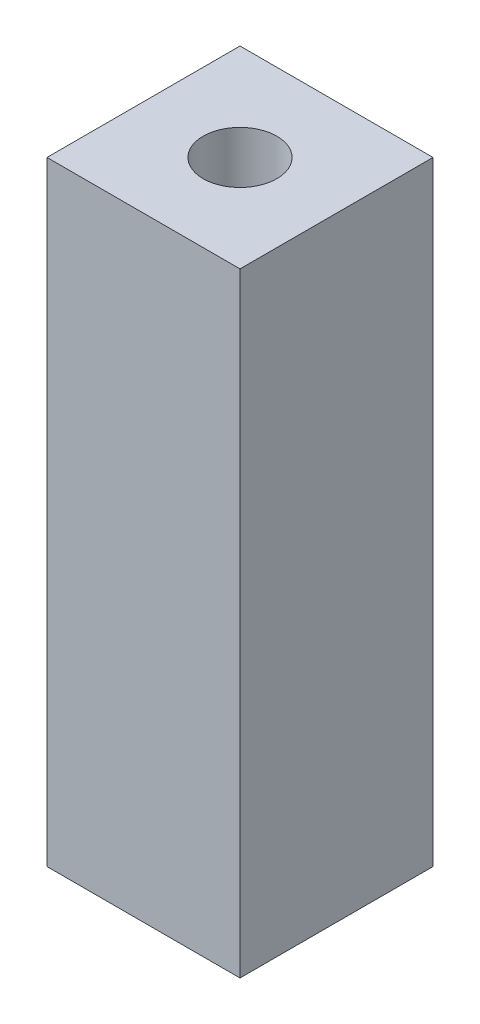
ISO-10303-21;
HEADER;
FILE_DESCRIPTION(('STEP AP214'),'2;1');
FILE_NAME('part.step','',(''),(''),'','','');
FILE_SCHEMA(('AUTOMOTIVE_DESIGN { 1 0 10303 214 1 1 1 1 }'));
ENDSEC;
DATA;
#1=APPLICATION_CONTEXT('core data for automotive mechanical design processes');
#2=APPLICATION_PROTOCOL_DEFINITION('international standard','automotive_design',2000,#1);
#3=PRODUCT_CONTEXT('',#1,'mechanical');
#4=PRODUCT('Part','Part','',(#3));
#5=PRODUCT_RELATED_PRODUCT_CATEGORY('part','',(#4));
#6=PRODUCT_DEFINITION_FORMATION('','',#4);
#7=PRODUCT_DEFINITION_CONTEXT('part definition',#1,'design');
#8=PRODUCT_DEFINITION('design','',#6,#7);
#9=PRODUCT_DEFINITION_SHAPE('','',#8);
#10=(LENGTH_UNIT() NAMED_UNIT(*) SI_UNIT(.MILLI.,.METRE.));
#11=(NAMED_UNIT(*) PLANE_ANGLE_UNIT() SI_UNIT($,.RADIAN.));
#12=(NAMED_UNIT(*) SI_UNIT($,.STERADIAN.) SOLID_ANGLE_UNIT());
#13=UNCERTAINTY_MEASURE_WITH_UNIT(LENGTH_MEASURE(1.E-05),#10,'distance_accuracy_value','');
#14=(GEOMETRIC_REPRESENTATION_CONTEXT(3) GLOBAL_UNCERTAINTY_ASSIGNED_CONTEXT((#13)) GLOBAL_UNIT_ASSIGNED_CONTEXT((#10,
#11,#12)) REPRESENTATION_CONTEXT('',''));
#15=CARTESIAN_POINT('',(0.,0.,0.));
#16=DIRECTION('',(0.,0.,1.));
#17=DIRECTION('',(1.,0.,0.));
#18=AXIS2_PLACEMENT_3D('',#15,#16,#17);
#19=CARTESIAN_POINT('',(5.5,35.,-5.5));
#20=DIRECTION('',(-1.,0.,0.));
#21=DIRECTION('',(0.,0.,1.));
#22=AXIS2_PLACEMENT_3D('',#19,#20,#21);
#23=PLANE('',#22);
#24=DIRECTION('',(0.,0.,-1.));
#25=VECTOR('',#24,1.);
#26=CARTESIAN_POINT('',(5.5,0.,-5.5));
#27=LINE('',#26,#25);
#28=CARTESIAN_POINT('',(5.5,0.,5.5));
#29=VERTEX_POINT('',#28);
#30=CARTESIAN_POINT('',(5.5,0.,-5.5));
#31=VERTEX_POINT('',#30);
#32=EDGE_CURVE('E106',#29,#31,#27,.T.);
#33=ORIENTED_EDGE('',*,*,#32,.T.);
#34=DIRECTION('',(0.,-1.,0.));
#35=VECTOR('',#34,1.);
#36=CARTESIAN_POINT('',(5.5,35.,-5.5));
#37=LINE('',#36,#35);
#38=CARTESIAN_POINT('',(5.5,35.,-5.5));
#39=VERTEX_POINT('',#38);
#40=EDGE_CURVE('E11',#39,#31,#37,.T.);
#41=ORIENTED_EDGE('',*,*,#40,.F.);
#42=DIRECTION('',(0.,0.,-1.));
#43=VECTOR('',#42,1.);
#44=CARTESIAN_POINT('',(5.5,35.,-5.5));
#45=LINE('',#44,#43);
#46=CARTESIAN_POINT('',(5.5,35.,5.5));
#47=VERTEX_POINT('',#46);
#48=EDGE_CURVE('E94',#47,#39,#45,.T.);
#49=ORIENTED_EDGE('',*,*,#48,.F.);
#50=DIRECTION('',(0.,-1.,0.));
#51=VECTOR('',#50,1.);
#52=CARTESIAN_POINT('',(5.5,35.,5.5));
#53=LINE('',#52,#51);
#54=EDGE_CURVE('E102',#47,#29,#53,.T.);
#55=ORIENTED_EDGE('',*,*,#54,.T.);
#56=EDGE_LOOP('',(#33,#41,#49,#55));
#57=FACE_BOUND('',#56,.T.);
#58=ADVANCED_FACE('F43',(#57),#23,.F.);
#59=CARTESIAN_POINT('',(-5.5,35.,-5.5));
#60=DIRECTION('',(0.,0.,1.));
#61=DIRECTION('',(1.,0.,0.));
#62=AXIS2_PLACEMENT_3D('',#59,#60,#61);
#63=PLANE('',#62);
#64=DIRECTION('',(-1.,0.,0.));
#65=VECTOR('',#64,1.);
#66=CARTESIAN_POINT('',(-5.5,0.,-5.5));
#67=LINE('',#66,#65);
#68=CARTESIAN_POINT('',(-5.5,0.,-5.5));
#69=VERTEX_POINT('',#68);
#70=EDGE_CURVE('E98',#31,#69,#67,.T.);
#71=ORIENTED_EDGE('',*,*,#70,.T.);
#72=DIRECTION('',(0.,-1.,0.));
#73=VECTOR('',#72,1.);
#74=CARTESIAN_POINT('',(-5.5,35.,-5.5));
#75=LINE('',#74,#73);
#76=CARTESIAN_POINT('',(-5.5,35.,-5.5));
#77=VERTEX_POINT('',#76);
#78=EDGE_CURVE('E51',#77,#69,#75,.T.);
#79=ORIENTED_EDGE('',*,*,#78,.F.);
#80=DIRECTION('',(-1.,0.,0.));
#81=VECTOR('',#80,1.);
#82=CARTESIAN_POINT('',(-5.5,35.,-5.5));
#83=LINE('',#82,#81);
#84=EDGE_CURVE('E89',#39,#77,#83,.T.);
#85=ORIENTED_EDGE('',*,*,#84,.F.);
#86=ORIENTED_EDGE('',*,*,#40,.T.);
#87=EDGE_LOOP('',(#71,#79,#85,#86));
#88=FACE_BOUND('',#87,.T.);
#89=ADVANCED_FACE('F97',(#88),#63,.F.);
#90=CARTESIAN_POINT('',(-5.5,35.,-5.5));
#91=DIRECTION('',(1.,0.,0.));
#92=DIRECTION('',(0.,0.,-1.));
#93=AXIS2_PLACEMENT_3D('',#90,#91,#92);
#94=PLANE('',#93);
#95=DIRECTION('',(0.,0.,1.));
#96=VECTOR('',#95,1.);
#97=CARTESIAN_POINT('',(-5.5,0.,-5.5));
#98=LINE('',#97,#96);
#99=CARTESIAN_POINT('',(-5.5,0.,5.5));
#100=VERTEX_POINT('',#99);
#101=EDGE_CURVE('E76',#69,#100,#98,.T.);
#102=ORIENTED_EDGE('',*,*,#101,.T.);
#103=DIRECTION('',(0.,-1.,0.));
#104=VECTOR('',#103,1.);
#105=CARTESIAN_POINT('',(-5.5,35.,5.5));
#106=LINE('',#105,#104);
#107=CARTESIAN_POINT('',(-5.5,35.,5.5));
#108=VERTEX_POINT('',#107);
#109=EDGE_CURVE('E99',#108,#100,#106,.T.);
#110=ORIENTED_EDGE('',*,*,#109,.F.);
#111=DIRECTION('',(0.,0.,1.));
#112=VECTOR('',#111,1.);
#113=CARTESIAN_POINT('',(-5.5,35.,-5.5));
#114=LINE('',#113,#112);
#115=EDGE_CURVE('E92',#77,#108,#114,.T.);
#116=ORIENTED_EDGE('',*,*,#115,.F.);
#117=ORIENTED_EDGE('',*,*,#78,.T.);
#118=EDGE_LOOP('',(#102,#110,#116,#117));
#119=FACE_BOUND('',#118,.T.);
#120=ADVANCED_FACE('F100',(#119),#94,.F.);
#121=CARTESIAN_POINT('',(-5.5,35.,5.5));
#122=DIRECTION('',(0.,0.,-1.));
#123=DIRECTION('',(-1.,0.,0.));
#124=AXIS2_PLACEMENT_3D('',#121,#122,#123);
#125=PLANE('',#124);
#126=DIRECTION('',(1.,0.,0.));
#127=VECTOR('',#126,1.);
#128=CARTESIAN_POINT('',(-5.5,0.,5.5));
#129=LINE('',#128,#127);
#130=EDGE_CURVE('E82',#100,#29,#129,.T.);
#131=ORIENTED_EDGE('',*,*,#130,.T.);
#132=ORIENTED_EDGE('',*,*,#54,.F.);
#133=DIRECTION('',(1.,0.,0.));
#134=VECTOR('',#133,1.);
#135=CARTESIAN_POINT('',(-5.5,35.,5.5));
#136=LINE('',#135,#134);
#137=EDGE_CURVE('E59',#108,#47,#136,.T.);
#138=ORIENTED_EDGE('',*,*,#137,.F.);
#139=ORIENTED_EDGE('',*,*,#109,.T.);
#140=EDGE_LOOP('',(#131,#132,#138,#139));
#141=FACE_BOUND('',#140,.T.);
#142=ADVANCED_FACE('F114',(#141),#125,.F.);
#143=CARTESIAN_POINT('',(0.,35.,0.));
#144=DIRECTION('',(0.,1.,0.));
#145=DIRECTION('',(0.,0.,1.));
#146=AXIS2_PLACEMENT_3D('',#143,#144,#145);
#147=PLANE('',#146);
#148=CARTESIAN_POINT('',(0.,35.,0.));
#149=DIRECTION('',(0.,1.,0.));
#150=DIRECTION('',(0.,0.,1.));
#151=AXIS2_PLACEMENT_3D('',#148,#149,#150);
#152=CIRCLE('',#151,2.09999999999999);
#153=CARTESIAN_POINT('',(0.,35.,2.09999999999999));
#154=VERTEX_POINT('',#153);
#155=EDGE_CURVE('E122',#154,#154,#152,.T.);
#156=ORIENTED_EDGE('',*,*,#155,.F.);
#157=EDGE_LOOP('',(#156));
#158=FACE_BOUND('',#157,.T.);
#159=ORIENTED_EDGE('',*,*,#48,.T.);
#160=ORIENTED_EDGE('',*,*,#84,.T.);
#161=ORIENTED_EDGE('',*,*,#115,.T.);
#162=ORIENTED_EDGE('',*,*,#137,.T.);
#163=EDGE_LOOP('',(#159,#160,#161,#162));
#164=FACE_BOUND('',#163,.T.);
#165=ADVANCED_FACE('F90',(#158,#164),#147,.T.);
#166=CARTESIAN_POINT('',(0.,0.,0.));
#167=DIRECTION('',(0.,1.,0.));
#168=DIRECTION('',(0.,0.,1.));
#169=AXIS2_PLACEMENT_3D('',#166,#167,#168);
#170=PLANE('',#169);
#171=CARTESIAN_POINT('',(0.,0.,0.));
#172=DIRECTION('',(0.,1.,0.));
#173=DIRECTION('',(0.,0.,1.));
#174=AXIS2_PLACEMENT_3D('',#171,#172,#173);
#175=CIRCLE('',#174,2.1);
#176=CARTESIAN_POINT('',(0.,0.,2.1));
#177=VERTEX_POINT('',#176);
#178=EDGE_CURVE('E109',#177,#177,#175,.T.);
#179=ORIENTED_EDGE('',*,*,#178,.T.);
#180=EDGE_LOOP('',(#179));
#181=FACE_BOUND('',#180,.T.);
#182=ORIENTED_EDGE('',*,*,#32,.F.);
#183=ORIENTED_EDGE('',*,*,#130,.F.);
#184=ORIENTED_EDGE('',*,*,#101,.F.);
#185=ORIENTED_EDGE('',*,*,#70,.F.);
#186=EDGE_LOOP('',(#182,#183,#184,#185));
#187=FACE_BOUND('',#186,.T.);
#188=ADVANCED_FACE('F117',(#181,#187),#170,.F.);
#189=CARTESIAN_POINT('',(0.,35.,0.));
#190=DIRECTION('',(0.,1.,0.));
#191=DIRECTION('',(0.,0.,1.));
#192=AXIS2_PLACEMENT_3D('',#189,#190,#191);
#193=CYLINDRICAL_SURFACE('',#192,2.09999999999999);
#194=ORIENTED_EDGE('',*,*,#178,.F.);
#195=EDGE_LOOP('',(#194));
#196=FACE_BOUND('',#195,.T.);
#197=ORIENTED_EDGE('',*,*,#155,.T.);
#198=EDGE_LOOP('',(#197));
#199=FACE_BOUND('',#198,.T.);
#200=ADVANCED_FACE('F126',(#196,#199),#193,.F.);
#201=CLOSED_SHELL('',(#58,#89,#120,#142,#165,#188,#200));
#202=MANIFOLD_SOLID_BREP('B2',#201);
#203=ADVANCED_BREP_SHAPE_REPRESENTATION('',(#18,#202),#14);
#204=SHAPE_DEFINITION_REPRESENTATION(#9,#203);
ENDSEC;
END-ISO-10303-21;
